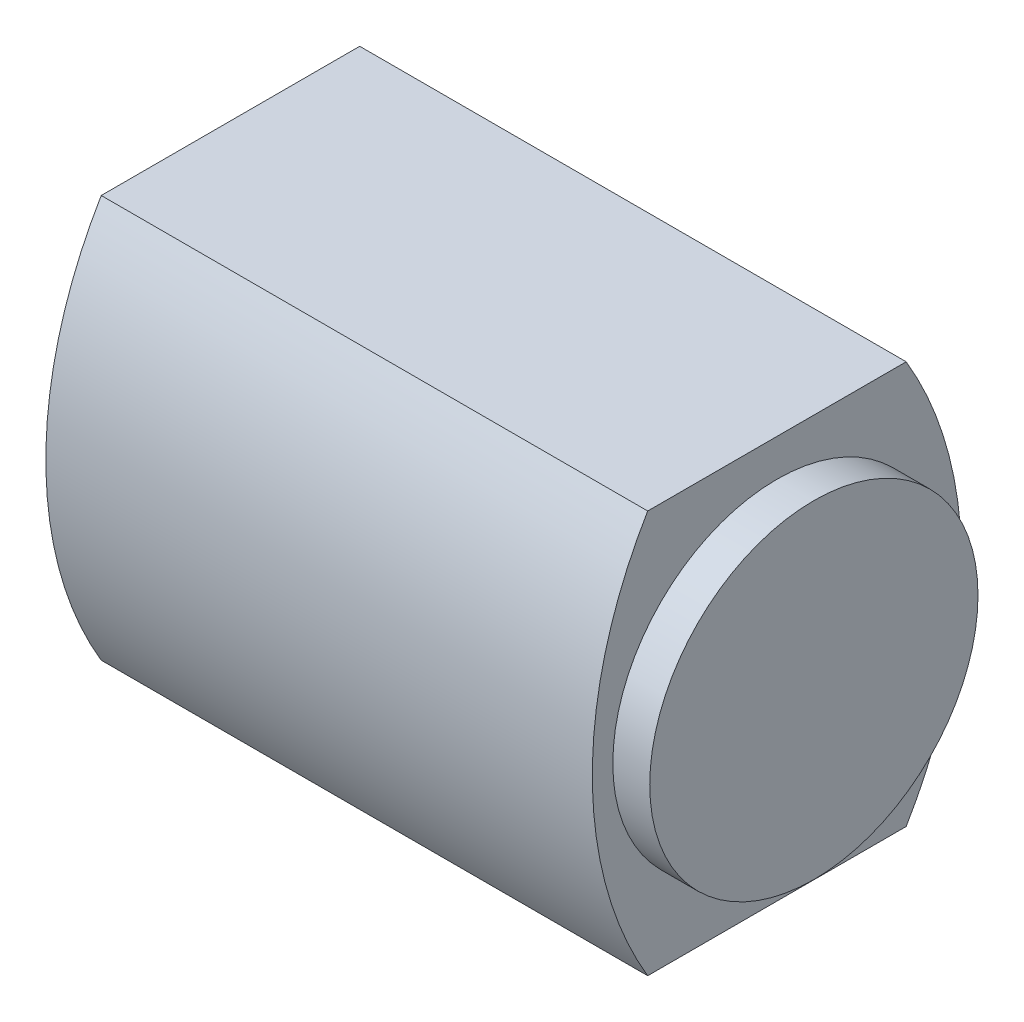
ISO-10303-21;
HEADER;
FILE_DESCRIPTION(('STEP AP214'),'2;1');
FILE_NAME('part.step','',(''),(''),'','','');
FILE_SCHEMA(('AUTOMOTIVE_DESIGN { 1 0 10303 214 1 1 1 1 }'));
ENDSEC;
DATA;
#1=APPLICATION_CONTEXT('core data for automotive mechanical design processes');
#2=APPLICATION_PROTOCOL_DEFINITION('international standard','automotive_design',2000,#1);
#3=PRODUCT_CONTEXT('',#1,'mechanical');
#4=PRODUCT('Part','Part','',(#3));
#5=PRODUCT_RELATED_PRODUCT_CATEGORY('part','',(#4));
#6=PRODUCT_DEFINITION_FORMATION('','',#4);
#7=PRODUCT_DEFINITION_CONTEXT('part definition',#1,'design');
#8=PRODUCT_DEFINITION('design','',#6,#7);
#9=PRODUCT_DEFINITION_SHAPE('','',#8);
#10=(LENGTH_UNIT() NAMED_UNIT(*) SI_UNIT(.MILLI.,.METRE.));
#11=(NAMED_UNIT(*) PLANE_ANGLE_UNIT() SI_UNIT($,.RADIAN.));
#12=(NAMED_UNIT(*) SI_UNIT($,.STERADIAN.) SOLID_ANGLE_UNIT());
#13=UNCERTAINTY_MEASURE_WITH_UNIT(LENGTH_MEASURE(1.E-05),#10,'distance_accuracy_value','');
#14=(GEOMETRIC_REPRESENTATION_CONTEXT(3) GLOBAL_UNCERTAINTY_ASSIGNED_CONTEXT((#13)) GLOBAL_UNIT_ASSIGNED_CONTEXT((#10,
#11,#12)) REPRESENTATION_CONTEXT('',''));
#15=CARTESIAN_POINT('',(0.,0.,0.));
#16=DIRECTION('',(0.,0.,1.));
#17=DIRECTION('',(1.,0.,0.));
#18=AXIS2_PLACEMENT_3D('',#15,#16,#17);
#19=CARTESIAN_POINT('',(148.,7.7715611723761E-13,-56.5083333333335));
#20=DIRECTION('',(1.,0.,0.));
#21=DIRECTION('',(0.,0.,-1.));
#22=AXIS2_PLACEMENT_3D('',#19,#20,#21);
#23=PLANE('',#22);
#24=CARTESIAN_POINT('',(148.,0.,0.));
#25=DIRECTION('',(1.,0.,0.));
#26=DIRECTION('',(0.,0.,-1.));
#27=AXIS2_PLACEMENT_3D('',#24,#25,#26);
#28=CIRCLE('',#27,44.45);
#29=CARTESIAN_POINT('',(148.,0.,-44.45));
#30=VERTEX_POINT('',#29);
#31=EDGE_CURVE('E12',#30,#30,#28,.T.);
#32=ORIENTED_EDGE('',*,*,#31,.F.);
#33=EDGE_LOOP('',(#32));
#34=FACE_BOUND('',#33,.T.);
#35=CARTESIAN_POINT('',(148.,7.7715611723761E-13,-56.5083333333335));
#36=DIRECTION('',(1.,0.,0.));
#37=DIRECTION('',(0.,0.,-1.));
#38=AXIS2_PLACEMENT_3D('',#35,#36,#37);
#39=CIRCLE('',#38,106.508333333333);
#40=CARTESIAN_POINT('',(148.,54.4999999999995,35.0000000000008));
#41=VERTEX_POINT('',#40);
#42=CARTESIAN_POINT('',(148.,-54.5000000000009,34.9999999999998));
#43=VERTEX_POINT('',#42);
#44=EDGE_CURVE('E128',#41,#43,#39,.T.);
#45=ORIENTED_EDGE('',*,*,#44,.T.);
#46=DIRECTION('',(0.,0.,-1.));
#47=VECTOR('',#46,1.);
#48=CARTESIAN_POINT('',(148.,-54.4999999999995,-35.0000000000008));
#49=LINE('',#48,#47);
#50=CARTESIAN_POINT('',(148.,-54.4999999999995,-35.0000000000008));
#51=VERTEX_POINT('',#50);
#52=EDGE_CURVE('E130',#43,#51,#49,.T.);
#53=ORIENTED_EDGE('',*,*,#52,.T.);
#54=CARTESIAN_POINT('',(148.,-8.04911692853238E-13,56.5083333333334));
#55=DIRECTION('',(1.,0.,0.));
#56=DIRECTION('',(0.,0.,1.));
#57=AXIS2_PLACEMENT_3D('',#54,#55,#56);
#58=CIRCLE('',#57,106.508333333333);
#59=CARTESIAN_POINT('',(148.,54.5000000000005,-34.9999999999992));
#60=VERTEX_POINT('',#59);
#61=EDGE_CURVE('E126',#51,#60,#58,.T.);
#62=ORIENTED_EDGE('',*,*,#61,.T.);
#63=DIRECTION('',(0.,0.,1.));
#64=VECTOR('',#63,1.);
#65=CARTESIAN_POINT('',(148.,54.5000000000005,-34.9999999999992));
#66=LINE('',#65,#64);
#67=EDGE_CURVE('E62',#60,#41,#66,.T.);
#68=ORIENTED_EDGE('',*,*,#67,.T.);
#69=EDGE_LOOP('',(#45,#53,#62,#68));
#70=FACE_BOUND('',#69,.T.);
#71=ADVANCED_FACE('F52',(#34,#70),#23,.T.);
#72=CARTESIAN_POINT('',(0.,1.90358897418554E-13,-56.5083333333335));
#73=DIRECTION('',(1.,0.,0.));
#74=DIRECTION('',(0.,0.,-1.));
#75=AXIS2_PLACEMENT_3D('',#72,#73,#74);
#76=PLANE('',#75);
#77=CARTESIAN_POINT('',(0.,1.90358897418554E-13,-56.5083333333335));
#78=DIRECTION('',(1.,0.,0.));
#79=DIRECTION('',(0.,0.,-1.));
#80=AXIS2_PLACEMENT_3D('',#77,#78,#79);
#81=CIRCLE('',#80,106.508333333334);
#82=CARTESIAN_POINT('',(0.,54.4999999999999,35.0000000000002));
#83=VERTEX_POINT('',#82);
#84=CARTESIAN_POINT('',(0.,-54.5000000000001,34.9999999999998));
#85=VERTEX_POINT('',#84);
#86=EDGE_CURVE('E121',#83,#85,#81,.T.);
#87=ORIENTED_EDGE('',*,*,#86,.F.);
#88=DIRECTION('',(0.,0.,1.));
#89=VECTOR('',#88,1.);
#90=CARTESIAN_POINT('',(0.,54.5000000000001,-34.9999999999998));
#91=LINE('',#90,#89);
#92=CARTESIAN_POINT('',(0.,54.5000000000001,-34.9999999999998));
#93=VERTEX_POINT('',#92);
#94=EDGE_CURVE('E105',#93,#83,#91,.T.);
#95=ORIENTED_EDGE('',*,*,#94,.F.);
#96=CARTESIAN_POINT('',(0.,-1.97297791322461E-13,56.5083333333334));
#97=DIRECTION('',(1.,0.,0.));
#98=DIRECTION('',(0.,0.,1.));
#99=AXIS2_PLACEMENT_3D('',#96,#97,#98);
#100=CIRCLE('',#99,106.508333333333);
#101=CARTESIAN_POINT('',(0.,-54.4999999999999,-35.0000000000002));
#102=VERTEX_POINT('',#101);
#103=EDGE_CURVE('E96',#102,#93,#100,.T.);
#104=ORIENTED_EDGE('',*,*,#103,.F.);
#105=DIRECTION('',(0.,0.,-1.));
#106=VECTOR('',#105,1.);
#107=CARTESIAN_POINT('',(0.,-54.4999999999999,-35.0000000000002));
#108=LINE('',#107,#106);
#109=EDGE_CURVE('E101',#85,#102,#108,.T.);
#110=ORIENTED_EDGE('',*,*,#109,.F.);
#111=EDGE_LOOP('',(#87,#95,#104,#110));
#112=FACE_BOUND('',#111,.T.);
#113=ADVANCED_FACE('F100',(#112),#76,.F.);
#114=CARTESIAN_POINT('',(1.40536043763254E-13,54.5000000000004,7.56339435525893E-13));
#115=DIRECTION('',(0.,-1.,0.));
#116=DIRECTION('',(0.,0.,-1.));
#117=AXIS2_PLACEMENT_3D('',#114,#115,#116);
#118=PLANE('',#117);
#119=DIRECTION('',(1.,0.,0.));
#120=VECTOR('',#119,1.);
#121=CARTESIAN_POINT('',(0.,54.4999999999999,35.0000000000002));
#122=LINE('',#121,#120);
#123=EDGE_CURVE('E172',#83,#41,#122,.T.);
#124=ORIENTED_EDGE('',*,*,#123,.T.);
#125=ORIENTED_EDGE('',*,*,#67,.F.);
#126=DIRECTION('',(1.,0.,0.));
#127=VECTOR('',#126,1.);
#128=CARTESIAN_POINT('',(0.,54.5000000000001,-34.9999999999998));
#129=LINE('',#128,#127);
#130=EDGE_CURVE('E78',#93,#60,#129,.T.);
#131=ORIENTED_EDGE('',*,*,#130,.F.);
#132=ORIENTED_EDGE('',*,*,#94,.T.);
#133=EDGE_LOOP('',(#124,#125,#131,#132));
#134=FACE_BOUND('',#133,.T.);
#135=ADVANCED_FACE('F153',(#134),#118,.F.);
#136=CARTESIAN_POINT('',(0.,-1.97297791322461E-13,56.5083333333334));
#137=DIRECTION('',(1.,0.,0.));
#138=DIRECTION('',(0.,0.,-1.));
#139=AXIS2_PLACEMENT_3D('',#136,#137,#138);
#140=CYLINDRICAL_SURFACE('',#139,106.508333333334);
#141=ORIENTED_EDGE('',*,*,#130,.T.);
#142=ORIENTED_EDGE('',*,*,#61,.F.);
#143=DIRECTION('',(1.,0.,0.));
#144=VECTOR('',#143,1.);
#145=CARTESIAN_POINT('',(0.,-54.4999999999999,-35.0000000000002));
#146=LINE('',#145,#144);
#147=EDGE_CURVE('E117',#102,#51,#146,.T.);
#148=ORIENTED_EDGE('',*,*,#147,.F.);
#149=ORIENTED_EDGE('',*,*,#103,.T.);
#150=EDGE_LOOP('',(#141,#142,#148,#149));
#151=FACE_BOUND('',#150,.T.);
#152=ADVANCED_FACE('F125',(#151),#140,.T.);
#153=CARTESIAN_POINT('',(0.,1.90358897418554E-13,-56.5083333333335));
#154=DIRECTION('',(1.,0.,0.));
#155=DIRECTION('',(0.,0.,-1.));
#156=AXIS2_PLACEMENT_3D('',#153,#154,#155);
#157=CYLINDRICAL_SURFACE('',#156,106.508333333334);
#158=DIRECTION('',(1.,0.,0.));
#159=VECTOR('',#158,1.);
#160=CARTESIAN_POINT('',(0.,-54.5000000000001,34.9999999999998));
#161=LINE('',#160,#159);
#162=EDGE_CURVE('E120',#85,#43,#161,.T.);
#163=ORIENTED_EDGE('',*,*,#162,.T.);
#164=ORIENTED_EDGE('',*,*,#44,.F.);
#165=ORIENTED_EDGE('',*,*,#123,.F.);
#166=ORIENTED_EDGE('',*,*,#86,.T.);
#167=EDGE_LOOP('',(#163,#164,#165,#166));
#168=FACE_BOUND('',#167,.T.);
#169=ADVANCED_FACE('F152',(#168),#157,.T.);
#170=CARTESIAN_POINT('',(1.30315240580474E-13,-54.4999999999998,0.));
#171=DIRECTION('',(0.,1.,0.));
#172=DIRECTION('',(-1.,0.,0.));
#173=AXIS2_PLACEMENT_3D('',#170,#171,#172);
#174=PLANE('',#173);
#175=ORIENTED_EDGE('',*,*,#147,.T.);
#176=ORIENTED_EDGE('',*,*,#52,.F.);
#177=ORIENTED_EDGE('',*,*,#162,.F.);
#178=ORIENTED_EDGE('',*,*,#109,.T.);
#179=EDGE_LOOP('',(#175,#176,#177,#178));
#180=FACE_BOUND('',#179,.T.);
#181=ADVANCED_FACE('F116',(#180),#174,.F.);
#182=CARTESIAN_POINT('',(158.,0.,0.));
#183=DIRECTION('',(-1.,0.,0.));
#184=DIRECTION('',(0.,0.,1.));
#185=AXIS2_PLACEMENT_3D('',#182,#183,#184);
#186=CYLINDRICAL_SURFACE('',#185,44.45);
#187=CARTESIAN_POINT('',(158.,0.,0.));
#188=DIRECTION('',(1.,0.,0.));
#189=DIRECTION('',(0.,0.,-1.));
#190=AXIS2_PLACEMENT_3D('',#187,#188,#189);
#191=CIRCLE('',#190,44.45);
#192=CARTESIAN_POINT('',(158.,0.,-44.45));
#193=VERTEX_POINT('',#192);
#194=EDGE_CURVE('E257',#193,#193,#191,.T.);
#195=ORIENTED_EDGE('',*,*,#194,.F.);
#196=EDGE_LOOP('',(#195));
#197=FACE_BOUND('',#196,.T.);
#198=ORIENTED_EDGE('',*,*,#31,.T.);
#199=EDGE_LOOP('',(#198));
#200=FACE_BOUND('',#199,.T.);
#201=ADVANCED_FACE('F191',(#197,#200),#186,.T.);
#202=CARTESIAN_POINT('',(158.,0.,0.));
#203=DIRECTION('',(1.,0.,0.));
#204=DIRECTION('',(0.,0.,-1.));
#205=AXIS2_PLACEMENT_3D('',#202,#203,#204);
#206=PLANE('',#205);
#207=ORIENTED_EDGE('',*,*,#194,.T.);
#208=EDGE_LOOP('',(#207));
#209=FACE_BOUND('',#208,.T.);
#210=ADVANCED_FACE('F270',(#209),#206,.T.);
#211=CLOSED_SHELL('',(#71,#113,#135,#152,#169,#181,#201,#210));
#212=MANIFOLD_SOLID_BREP('B2',#211);
#213=ADVANCED_BREP_SHAPE_REPRESENTATION('',(#18,#212),#14);
#214=SHAPE_DEFINITION_REPRESENTATION(#9,#213);
ENDSEC;
END-ISO-10303-21;
